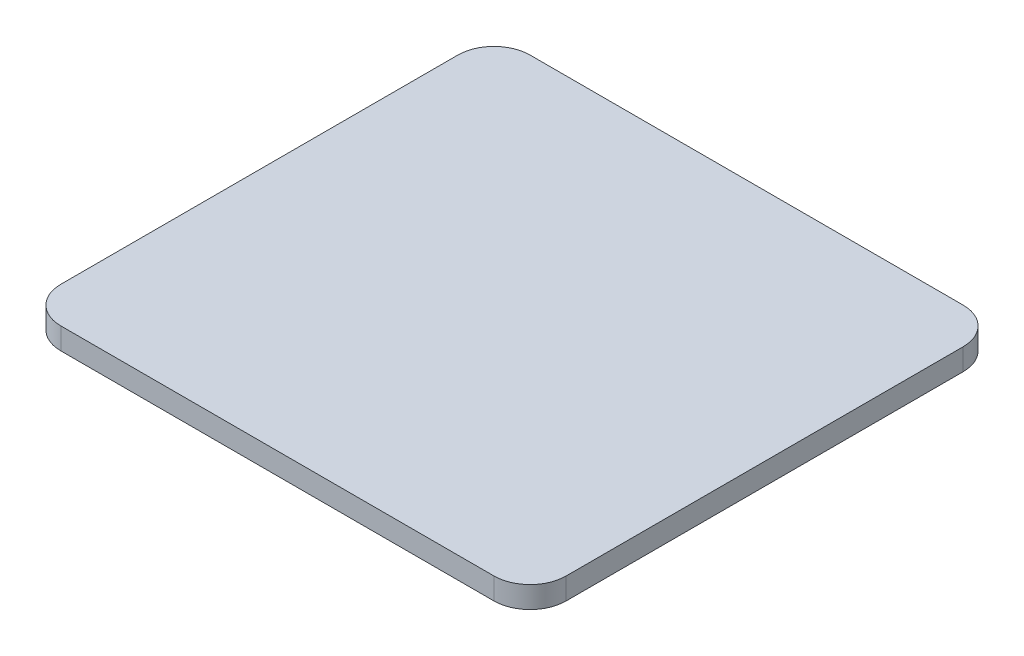
ISO-10303-21;
HEADER;
FILE_DESCRIPTION(('STEP AP214'),'2;1');
FILE_NAME('part.step','',(''),(''),'','','');
FILE_SCHEMA(('AUTOMOTIVE_DESIGN { 1 0 10303 214 1 1 1 1 }'));
ENDSEC;
DATA;
#1=APPLICATION_CONTEXT('core data for automotive mechanical design processes');
#2=APPLICATION_PROTOCOL_DEFINITION('international standard','automotive_design',2000,#1);
#3=PRODUCT_CONTEXT('',#1,'mechanical');
#4=PRODUCT('Part','Part','',(#3));
#5=PRODUCT_RELATED_PRODUCT_CATEGORY('part','',(#4));
#6=PRODUCT_DEFINITION_FORMATION('','',#4);
#7=PRODUCT_DEFINITION_CONTEXT('part definition',#1,'design');
#8=PRODUCT_DEFINITION('design','',#6,#7);
#9=PRODUCT_DEFINITION_SHAPE('','',#8);
#10=(LENGTH_UNIT() NAMED_UNIT(*) SI_UNIT(.MILLI.,.METRE.));
#11=(NAMED_UNIT(*) PLANE_ANGLE_UNIT() SI_UNIT($,.RADIAN.));
#12=(NAMED_UNIT(*) SI_UNIT($,.STERADIAN.) SOLID_ANGLE_UNIT());
#13=UNCERTAINTY_MEASURE_WITH_UNIT(LENGTH_MEASURE(1.E-05),#10,'distance_accuracy_value','');
#14=(GEOMETRIC_REPRESENTATION_CONTEXT(3) GLOBAL_UNCERTAINTY_ASSIGNED_CONTEXT((#13)) GLOBAL_UNIT_ASSIGNED_CONTEXT((#10,
#11,#12)) REPRESENTATION_CONTEXT('',''));
#15=CARTESIAN_POINT('',(0.,0.,0.));
#16=DIRECTION('',(0.,0.,1.));
#17=DIRECTION('',(1.,0.,0.));
#18=AXIS2_PLACEMENT_3D('',#15,#16,#17);
#19=CARTESIAN_POINT('',(35.,3.,-32.5));
#20=DIRECTION('',(-1.,0.,0.));
#21=DIRECTION('',(0.,0.,1.));
#22=AXIS2_PLACEMENT_3D('',#19,#20,#21);
#23=PLANE('',#22);
#24=DIRECTION('',(0.,0.,-1.));
#25=VECTOR('',#24,1.);
#26=CARTESIAN_POINT('',(35.,0.,-32.5));
#27=LINE('',#26,#25);
#28=CARTESIAN_POINT('',(35.,0.,27.5));
#29=VERTEX_POINT('',#28);
#30=CARTESIAN_POINT('',(35.,0.,-27.5));
#31=VERTEX_POINT('',#30);
#32=EDGE_CURVE('E133',#29,#31,#27,.T.);
#33=ORIENTED_EDGE('',*,*,#32,.T.);
#34=DIRECTION('',(0.,-1.,0.));
#35=VECTOR('',#34,1.);
#36=CARTESIAN_POINT('',(35.,3.,-27.5));
#37=LINE('',#36,#35);
#38=CARTESIAN_POINT('',(35.,3.,-27.5));
#39=VERTEX_POINT('',#38);
#40=EDGE_CURVE('E156',#31,#39,#37,.F.);
#41=ORIENTED_EDGE('',*,*,#40,.T.);
#42=DIRECTION('',(0.,0.,-1.));
#43=VECTOR('',#42,1.);
#44=CARTESIAN_POINT('',(35.,3.,-32.5));
#45=LINE('',#44,#43);
#46=CARTESIAN_POINT('',(35.,3.,27.5));
#47=VERTEX_POINT('',#46);
#48=EDGE_CURVE('E131',#47,#39,#45,.T.);
#49=ORIENTED_EDGE('',*,*,#48,.F.);
#50=DIRECTION('',(0.,-1.,0.));
#51=VECTOR('',#50,1.);
#52=CARTESIAN_POINT('',(35.,3.,27.5));
#53=LINE('',#52,#51);
#54=EDGE_CURVE('E153',#47,#29,#53,.T.);
#55=ORIENTED_EDGE('',*,*,#54,.T.);
#56=EDGE_LOOP('',(#33,#41,#49,#55));
#57=FACE_BOUND('',#56,.T.);
#58=ADVANCED_FACE('F38',(#57),#23,.F.);
#59=CARTESIAN_POINT('',(-35.,3.,-32.5));
#60=DIRECTION('',(0.,0.,1.));
#61=DIRECTION('',(1.,0.,0.));
#62=AXIS2_PLACEMENT_3D('',#59,#60,#61);
#63=PLANE('',#62);
#64=DIRECTION('',(-1.,0.,0.));
#65=VECTOR('',#64,1.);
#66=CARTESIAN_POINT('',(-35.,0.,-32.5));
#67=LINE('',#66,#65);
#68=CARTESIAN_POINT('',(30.,0.,-32.5));
#69=VERTEX_POINT('',#68);
#70=CARTESIAN_POINT('',(-30.,0.,-32.5));
#71=VERTEX_POINT('',#70);
#72=EDGE_CURVE('E129',#69,#71,#67,.T.);
#73=ORIENTED_EDGE('',*,*,#72,.T.);
#74=DIRECTION('',(0.,-1.,0.));
#75=VECTOR('',#74,1.);
#76=CARTESIAN_POINT('',(-30.,3.,-32.5));
#77=LINE('',#76,#75);
#78=CARTESIAN_POINT('',(-30.,3.,-32.5));
#79=VERTEX_POINT('',#78);
#80=EDGE_CURVE('E108',#71,#79,#77,.F.);
#81=ORIENTED_EDGE('',*,*,#80,.T.);
#82=DIRECTION('',(-1.,0.,0.));
#83=VECTOR('',#82,1.);
#84=CARTESIAN_POINT('',(-35.,3.,-32.5));
#85=LINE('',#84,#83);
#86=CARTESIAN_POINT('',(30.,3.,-32.5));
#87=VERTEX_POINT('',#86);
#88=EDGE_CURVE('E172',#87,#79,#85,.T.);
#89=ORIENTED_EDGE('',*,*,#88,.F.);
#90=DIRECTION('',(0.,-1.,0.));
#91=VECTOR('',#90,1.);
#92=CARTESIAN_POINT('',(30.,3.,-32.5));
#93=LINE('',#92,#91);
#94=EDGE_CURVE('E113',#87,#69,#93,.T.);
#95=ORIENTED_EDGE('',*,*,#94,.T.);
#96=EDGE_LOOP('',(#73,#81,#89,#95));
#97=FACE_BOUND('',#96,.T.);
#98=ADVANCED_FACE('F189',(#97),#63,.F.);
#99=CARTESIAN_POINT('',(-35.,3.,-32.5));
#100=DIRECTION('',(1.,0.,0.));
#101=DIRECTION('',(0.,0.,-1.));
#102=AXIS2_PLACEMENT_3D('',#99,#100,#101);
#103=PLANE('',#102);
#104=DIRECTION('',(0.,0.,1.));
#105=VECTOR('',#104,1.);
#106=CARTESIAN_POINT('',(-35.,3.,-32.5));
#107=LINE('',#106,#105);
#108=CARTESIAN_POINT('',(-35.,3.,-27.5));
#109=VERTEX_POINT('',#108);
#110=CARTESIAN_POINT('',(-35.,3.,27.5));
#111=VERTEX_POINT('',#110);
#112=EDGE_CURVE('E122',#109,#111,#107,.T.);
#113=ORIENTED_EDGE('',*,*,#112,.F.);
#114=DIRECTION('',(0.,-1.,0.));
#115=VECTOR('',#114,1.);
#116=CARTESIAN_POINT('',(-35.,3.,-27.5));
#117=LINE('',#116,#115);
#118=CARTESIAN_POINT('',(-35.,0.,-27.5));
#119=VERTEX_POINT('',#118);
#120=EDGE_CURVE('E107',#109,#119,#117,.T.);
#121=ORIENTED_EDGE('',*,*,#120,.T.);
#122=DIRECTION('',(0.,0.,1.));
#123=VECTOR('',#122,1.);
#124=CARTESIAN_POINT('',(-35.,0.,-32.5));
#125=LINE('',#124,#123);
#126=CARTESIAN_POINT('',(-35.,0.,27.5));
#127=VERTEX_POINT('',#126);
#128=EDGE_CURVE('E120',#119,#127,#125,.T.);
#129=ORIENTED_EDGE('',*,*,#128,.T.);
#130=DIRECTION('',(0.,-1.,0.));
#131=VECTOR('',#130,1.);
#132=CARTESIAN_POINT('',(-35.,3.,27.5));
#133=LINE('',#132,#131);
#134=EDGE_CURVE('E124',#127,#111,#133,.F.);
#135=ORIENTED_EDGE('',*,*,#134,.T.);
#136=EDGE_LOOP('',(#113,#121,#129,#135));
#137=FACE_BOUND('',#136,.T.);
#138=ADVANCED_FACE('F119',(#137),#103,.F.);
#139=CARTESIAN_POINT('',(-35.,3.,32.5));
#140=DIRECTION('',(0.,0.,-1.));
#141=DIRECTION('',(-1.,0.,0.));
#142=AXIS2_PLACEMENT_3D('',#139,#140,#141);
#143=PLANE('',#142);
#144=DIRECTION('',(1.,0.,0.));
#145=VECTOR('',#144,1.);
#146=CARTESIAN_POINT('',(-35.,0.,32.5));
#147=LINE('',#146,#145);
#148=CARTESIAN_POINT('',(-30.,0.,32.5));
#149=VERTEX_POINT('',#148);
#150=CARTESIAN_POINT('',(30.,0.,32.5));
#151=VERTEX_POINT('',#150);
#152=EDGE_CURVE('E128',#149,#151,#147,.T.);
#153=ORIENTED_EDGE('',*,*,#152,.T.);
#154=DIRECTION('',(0.,-1.,0.));
#155=VECTOR('',#154,1.);
#156=CARTESIAN_POINT('',(30.,3.,32.5));
#157=LINE('',#156,#155);
#158=CARTESIAN_POINT('',(30.,3.,32.5));
#159=VERTEX_POINT('',#158);
#160=EDGE_CURVE('E11',#151,#159,#157,.F.);
#161=ORIENTED_EDGE('',*,*,#160,.T.);
#162=DIRECTION('',(1.,0.,0.));
#163=VECTOR('',#162,1.);
#164=CARTESIAN_POINT('',(-35.,3.,32.5));
#165=LINE('',#164,#163);
#166=CARTESIAN_POINT('',(-30.,3.,32.5));
#167=VERTEX_POINT('',#166);
#168=EDGE_CURVE('E137',#167,#159,#165,.T.);
#169=ORIENTED_EDGE('',*,*,#168,.F.);
#170=DIRECTION('',(0.,-1.,0.));
#171=VECTOR('',#170,1.);
#172=CARTESIAN_POINT('',(-30.,3.,32.5));
#173=LINE('',#172,#171);
#174=EDGE_CURVE('E46',#167,#149,#173,.T.);
#175=ORIENTED_EDGE('',*,*,#174,.T.);
#176=EDGE_LOOP('',(#153,#161,#169,#175));
#177=FACE_BOUND('',#176,.T.);
#178=ADVANCED_FACE('F159',(#177),#143,.F.);
#179=CARTESIAN_POINT('',(0.,3.,0.));
#180=DIRECTION('',(0.,1.,0.));
#181=DIRECTION('',(0.,0.,1.));
#182=AXIS2_PLACEMENT_3D('',#179,#180,#181);
#183=PLANE('',#182);
#184=ORIENTED_EDGE('',*,*,#88,.T.);
#185=CARTESIAN_POINT('',(-30.,3.,-27.5));
#186=DIRECTION('',(0.,1.,0.));
#187=DIRECTION('',(0.,0.,1.));
#188=AXIS2_PLACEMENT_3D('',#185,#186,#187);
#189=CIRCLE('',#188,5.);
#190=EDGE_CURVE('E151',#79,#109,#189,.T.);
#191=ORIENTED_EDGE('',*,*,#190,.T.);
#192=ORIENTED_EDGE('',*,*,#112,.T.);
#193=CARTESIAN_POINT('',(-30.,3.,27.5));
#194=DIRECTION('',(0.,1.,0.));
#195=DIRECTION('',(0.,0.,1.));
#196=AXIS2_PLACEMENT_3D('',#193,#194,#195);
#197=CIRCLE('',#196,5.);
#198=EDGE_CURVE('E58',#111,#167,#197,.T.);
#199=ORIENTED_EDGE('',*,*,#198,.T.);
#200=ORIENTED_EDGE('',*,*,#168,.T.);
#201=CARTESIAN_POINT('',(30.,3.,27.5));
#202=DIRECTION('',(0.,1.,0.));
#203=DIRECTION('',(0.,0.,1.));
#204=AXIS2_PLACEMENT_3D('',#201,#202,#203);
#205=CIRCLE('',#204,5.);
#206=EDGE_CURVE('E147',#159,#47,#205,.T.);
#207=ORIENTED_EDGE('',*,*,#206,.T.);
#208=ORIENTED_EDGE('',*,*,#48,.T.);
#209=CARTESIAN_POINT('',(30.,3.,-27.5));
#210=DIRECTION('',(0.,1.,0.));
#211=DIRECTION('',(0.,0.,1.));
#212=AXIS2_PLACEMENT_3D('',#209,#210,#211);
#213=CIRCLE('',#212,5.);
#214=EDGE_CURVE('E149',#39,#87,#213,.T.);
#215=ORIENTED_EDGE('',*,*,#214,.T.);
#216=EDGE_LOOP('',(#184,#191,#192,#199,#200,#207,#208,#215));
#217=FACE_BOUND('',#216,.T.);
#218=ADVANCED_FACE('F178',(#217),#183,.T.);
#219=CARTESIAN_POINT('',(0.,0.,0.));
#220=DIRECTION('',(0.,1.,0.));
#221=DIRECTION('',(0.,0.,1.));
#222=AXIS2_PLACEMENT_3D('',#219,#220,#221);
#223=PLANE('',#222);
#224=ORIENTED_EDGE('',*,*,#128,.F.);
#225=CARTESIAN_POINT('',(-30.,0.,-27.5));
#226=DIRECTION('',(0.,1.,0.));
#227=DIRECTION('',(0.,0.,1.));
#228=AXIS2_PLACEMENT_3D('',#225,#226,#227);
#229=CIRCLE('',#228,5.);
#230=EDGE_CURVE('E103',#119,#71,#229,.F.);
#231=ORIENTED_EDGE('',*,*,#230,.T.);
#232=ORIENTED_EDGE('',*,*,#72,.F.);
#233=CARTESIAN_POINT('',(30.,0.,-27.5));
#234=DIRECTION('',(0.,1.,0.));
#235=DIRECTION('',(0.,0.,1.));
#236=AXIS2_PLACEMENT_3D('',#233,#234,#235);
#237=CIRCLE('',#236,5.);
#238=EDGE_CURVE('E114',#69,#31,#237,.F.);
#239=ORIENTED_EDGE('',*,*,#238,.T.);
#240=ORIENTED_EDGE('',*,*,#32,.F.);
#241=CARTESIAN_POINT('',(30.,0.,27.5));
#242=DIRECTION('',(0.,1.,0.));
#243=DIRECTION('',(0.,0.,1.));
#244=AXIS2_PLACEMENT_3D('',#241,#242,#243);
#245=CIRCLE('',#244,5.);
#246=EDGE_CURVE('E140',#29,#151,#245,.F.);
#247=ORIENTED_EDGE('',*,*,#246,.T.);
#248=ORIENTED_EDGE('',*,*,#152,.F.);
#249=CARTESIAN_POINT('',(-30.,0.,27.5));
#250=DIRECTION('',(0.,1.,0.));
#251=DIRECTION('',(0.,0.,1.));
#252=AXIS2_PLACEMENT_3D('',#249,#250,#251);
#253=CIRCLE('',#252,5.);
#254=EDGE_CURVE('E123',#149,#127,#253,.F.);
#255=ORIENTED_EDGE('',*,*,#254,.T.);
#256=EDGE_LOOP('',(#224,#231,#232,#239,#240,#247,#248,#255));
#257=FACE_BOUND('',#256,.T.);
#258=ADVANCED_FACE('F126',(#257),#223,.F.);
#259=CARTESIAN_POINT('',(-30.,3.,-27.5));
#260=DIRECTION('',(0.,-1.,0.));
#261=DIRECTION('',(0.,0.,-1.));
#262=AXIS2_PLACEMENT_3D('',#259,#260,#261);
#263=CYLINDRICAL_SURFACE('',#262,5.);
#264=ORIENTED_EDGE('',*,*,#190,.F.);
#265=ORIENTED_EDGE('',*,*,#80,.F.);
#266=ORIENTED_EDGE('',*,*,#230,.F.);
#267=ORIENTED_EDGE('',*,*,#120,.F.);
#268=EDGE_LOOP('',(#264,#265,#266,#267));
#269=FACE_BOUND('',#268,.T.);
#270=ADVANCED_FACE('F106',(#269),#263,.T.);
#271=CARTESIAN_POINT('',(30.,3.,-27.5));
#272=DIRECTION('',(0.,-1.,0.));
#273=DIRECTION('',(0.,0.,-1.));
#274=AXIS2_PLACEMENT_3D('',#271,#272,#273);
#275=CYLINDRICAL_SURFACE('',#274,5.);
#276=ORIENTED_EDGE('',*,*,#214,.F.);
#277=ORIENTED_EDGE('',*,*,#40,.F.);
#278=ORIENTED_EDGE('',*,*,#238,.F.);
#279=ORIENTED_EDGE('',*,*,#94,.F.);
#280=EDGE_LOOP('',(#276,#277,#278,#279));
#281=FACE_BOUND('',#280,.T.);
#282=ADVANCED_FACE('F200',(#281),#275,.T.);
#283=CARTESIAN_POINT('',(30.,3.,27.5));
#284=DIRECTION('',(0.,-1.,0.));
#285=DIRECTION('',(0.,0.,-1.));
#286=AXIS2_PLACEMENT_3D('',#283,#284,#285);
#287=CYLINDRICAL_SURFACE('',#286,5.);
#288=ORIENTED_EDGE('',*,*,#206,.F.);
#289=ORIENTED_EDGE('',*,*,#160,.F.);
#290=ORIENTED_EDGE('',*,*,#246,.F.);
#291=ORIENTED_EDGE('',*,*,#54,.F.);
#292=EDGE_LOOP('',(#288,#289,#290,#291));
#293=FACE_BOUND('',#292,.T.);
#294=ADVANCED_FACE('F166',(#293),#287,.T.);
#295=CARTESIAN_POINT('',(-30.,3.,27.5));
#296=DIRECTION('',(0.,-1.,0.));
#297=DIRECTION('',(0.,0.,-1.));
#298=AXIS2_PLACEMENT_3D('',#295,#296,#297);
#299=CYLINDRICAL_SURFACE('',#298,5.);
#300=ORIENTED_EDGE('',*,*,#198,.F.);
#301=ORIENTED_EDGE('',*,*,#134,.F.);
#302=ORIENTED_EDGE('',*,*,#254,.F.);
#303=ORIENTED_EDGE('',*,*,#174,.F.);
#304=EDGE_LOOP('',(#300,#301,#302,#303));
#305=FACE_BOUND('',#304,.T.);
#306=ADVANCED_FACE('F40',(#305),#299,.T.);
#307=CLOSED_SHELL('',(#58,#98,#138,#178,#218,#258,#270,#282,#294,#306));
#308=MANIFOLD_SOLID_BREP('B2',#307);
#309=ADVANCED_BREP_SHAPE_REPRESENTATION('',(#18,#308),#14);
#310=SHAPE_DEFINITION_REPRESENTATION(#9,#309);
ENDSEC;
END-ISO-10303-21;
